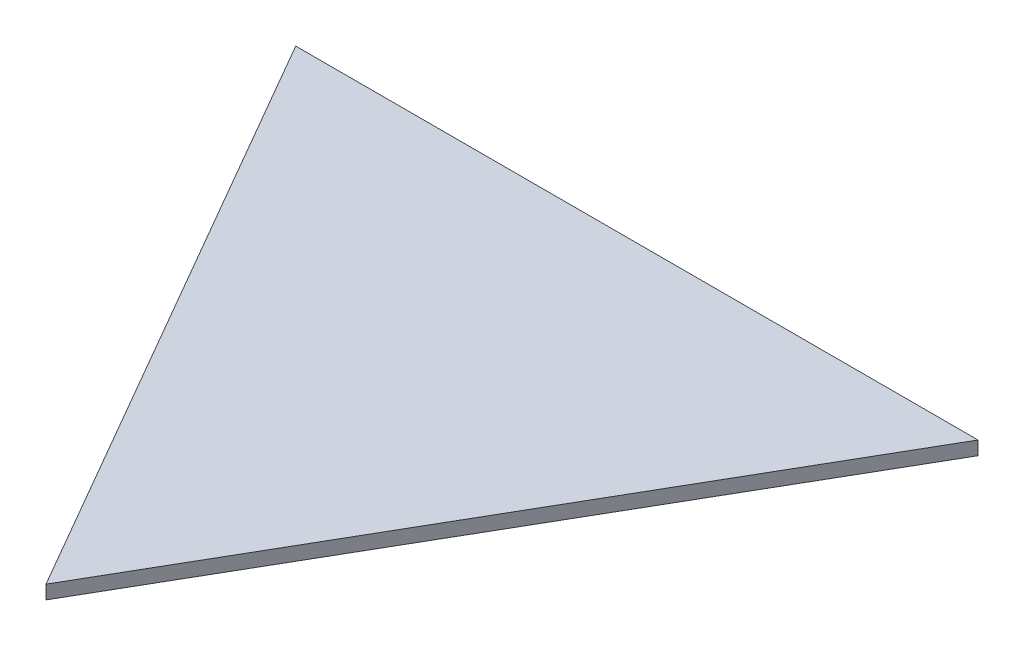
ISO-10303-21;
HEADER;
FILE_DESCRIPTION(('STEP AP214'),'2;1');
FILE_NAME('part.step','',(''),(''),'','','');
FILE_SCHEMA(('AUTOMOTIVE_DESIGN { 1 0 10303 214 1 1 1 1 }'));
ENDSEC;
DATA;
#1=APPLICATION_CONTEXT('core data for automotive mechanical design processes');
#2=APPLICATION_PROTOCOL_DEFINITION('international standard','automotive_design',2000,#1);
#3=PRODUCT_CONTEXT('',#1,'mechanical');
#4=PRODUCT('Part','Part','',(#3));
#5=PRODUCT_RELATED_PRODUCT_CATEGORY('part','',(#4));
#6=PRODUCT_DEFINITION_FORMATION('','',#4);
#7=PRODUCT_DEFINITION_CONTEXT('part definition',#1,'design');
#8=PRODUCT_DEFINITION('design','',#6,#7);
#9=PRODUCT_DEFINITION_SHAPE('','',#8);
#10=(LENGTH_UNIT() NAMED_UNIT(*) SI_UNIT(.MILLI.,.METRE.));
#11=(NAMED_UNIT(*) PLANE_ANGLE_UNIT() SI_UNIT($,.RADIAN.));
#12=(NAMED_UNIT(*) SI_UNIT($,.STERADIAN.) SOLID_ANGLE_UNIT());
#13=UNCERTAINTY_MEASURE_WITH_UNIT(LENGTH_MEASURE(1.E-05),#10,'distance_accuracy_value','');
#14=(GEOMETRIC_REPRESENTATION_CONTEXT(3) GLOBAL_UNCERTAINTY_ASSIGNED_CONTEXT((#13)) GLOBAL_UNIT_ASSIGNED_CONTEXT((#10,
#11,#12)) REPRESENTATION_CONTEXT('',''));
#15=CARTESIAN_POINT('',(0.,0.,0.));
#16=DIRECTION('',(0.,0.,1.));
#17=DIRECTION('',(1.,0.,0.));
#18=AXIS2_PLACEMENT_3D('',#15,#16,#17);
#19=CARTESIAN_POINT('',(250.,10.,-433.012701892219));
#20=DIRECTION('',(-0.866025403784439,0.,-0.5));
#21=DIRECTION('',(-0.5,0.,0.866025403784439));
#22=AXIS2_PLACEMENT_3D('',#19,#20,#21);
#23=PLANE('',#22);
#24=DIRECTION('',(0.5,0.,-0.866025403784439));
#25=VECTOR('',#24,1.);
#26=CARTESIAN_POINT('',(250.,0.,-433.012701892219));
#27=LINE('',#26,#25);
#28=CARTESIAN_POINT('',(0.,0.,0.));
#29=VERTEX_POINT('',#28);
#30=CARTESIAN_POINT('',(250.,0.,-433.012701892219));
#31=VERTEX_POINT('',#30);
#32=EDGE_CURVE('E80',#29,#31,#27,.T.);
#33=ORIENTED_EDGE('',*,*,#32,.T.);
#34=DIRECTION('',(0.,-1.,0.));
#35=VECTOR('',#34,1.);
#36=CARTESIAN_POINT('',(250.,10.,-433.012701892219));
#37=LINE('',#36,#35);
#38=CARTESIAN_POINT('',(250.,10.,-433.012701892219));
#39=VERTEX_POINT('',#38);
#40=EDGE_CURVE('E11',#39,#31,#37,.T.);
#41=ORIENTED_EDGE('',*,*,#40,.F.);
#42=DIRECTION('',(0.5,0.,-0.866025403784439));
#43=VECTOR('',#42,1.);
#44=CARTESIAN_POINT('',(250.,10.,-433.012701892219));
#45=LINE('',#44,#43);
#46=CARTESIAN_POINT('',(0.,10.,0.));
#47=VERTEX_POINT('',#46);
#48=EDGE_CURVE('E73',#47,#39,#45,.T.);
#49=ORIENTED_EDGE('',*,*,#48,.F.);
#50=DIRECTION('',(0.,-1.,0.));
#51=VECTOR('',#50,1.);
#52=CARTESIAN_POINT('',(0.,10.,0.));
#53=LINE('',#52,#51);
#54=EDGE_CURVE('E81',#47,#29,#53,.T.);
#55=ORIENTED_EDGE('',*,*,#54,.T.);
#56=EDGE_LOOP('',(#33,#41,#49,#55));
#57=FACE_BOUND('',#56,.T.);
#58=ADVANCED_FACE('F33',(#57),#23,.F.);
#59=CARTESIAN_POINT('',(-250.,10.,-433.012701892219));
#60=DIRECTION('',(0.,0.,1.));
#61=DIRECTION('',(1.,0.,0.));
#62=AXIS2_PLACEMENT_3D('',#59,#60,#61);
#63=PLANE('',#62);
#64=DIRECTION('',(-1.,0.,0.));
#65=VECTOR('',#64,1.);
#66=CARTESIAN_POINT('',(-250.,0.,-433.012701892219));
#67=LINE('',#66,#65);
#68=CARTESIAN_POINT('',(-250.,0.,-433.012701892219));
#69=VERTEX_POINT('',#68);
#70=EDGE_CURVE('E61',#31,#69,#67,.T.);
#71=ORIENTED_EDGE('',*,*,#70,.T.);
#72=DIRECTION('',(0.,-1.,0.));
#73=VECTOR('',#72,1.);
#74=CARTESIAN_POINT('',(-250.,10.,-433.012701892219));
#75=LINE('',#74,#73);
#76=CARTESIAN_POINT('',(-250.,10.,-433.012701892219));
#77=VERTEX_POINT('',#76);
#78=EDGE_CURVE('E41',#77,#69,#75,.T.);
#79=ORIENTED_EDGE('',*,*,#78,.F.);
#80=DIRECTION('',(-1.,0.,0.));
#81=VECTOR('',#80,1.);
#82=CARTESIAN_POINT('',(-250.,10.,-433.012701892219));
#83=LINE('',#82,#81);
#84=EDGE_CURVE('E69',#39,#77,#83,.T.);
#85=ORIENTED_EDGE('',*,*,#84,.F.);
#86=ORIENTED_EDGE('',*,*,#40,.T.);
#87=EDGE_LOOP('',(#71,#79,#85,#86));
#88=FACE_BOUND('',#87,.T.);
#89=ADVANCED_FACE('F70',(#88),#63,.F.);
#90=CARTESIAN_POINT('',(0.,10.,0.));
#91=DIRECTION('',(0.866025403784439,0.,-0.5));
#92=DIRECTION('',(-0.5,0.,-0.866025403784439));
#93=AXIS2_PLACEMENT_3D('',#90,#91,#92);
#94=PLANE('',#93);
#95=DIRECTION('',(0.5,0.,0.866025403784439));
#96=VECTOR('',#95,1.);
#97=CARTESIAN_POINT('',(0.,0.,0.));
#98=LINE('',#97,#96);
#99=EDGE_CURVE('E66',#69,#29,#98,.T.);
#100=ORIENTED_EDGE('',*,*,#99,.T.);
#101=ORIENTED_EDGE('',*,*,#54,.F.);
#102=DIRECTION('',(0.5,0.,0.866025403784439));
#103=VECTOR('',#102,1.);
#104=CARTESIAN_POINT('',(0.,10.,0.));
#105=LINE('',#104,#103);
#106=EDGE_CURVE('E49',#77,#47,#105,.T.);
#107=ORIENTED_EDGE('',*,*,#106,.F.);
#108=ORIENTED_EDGE('',*,*,#78,.T.);
#109=EDGE_LOOP('',(#100,#101,#107,#108));
#110=FACE_BOUND('',#109,.T.);
#111=ADVANCED_FACE('F88',(#110),#94,.F.);
#112=CARTESIAN_POINT('',(0.,10.,0.));
#113=DIRECTION('',(0.,-1.,0.));
#114=DIRECTION('',(0.,0.,-1.));
#115=AXIS2_PLACEMENT_3D('',#112,#113,#114);
#116=PLANE('',#115);
#117=ORIENTED_EDGE('',*,*,#48,.T.);
#118=ORIENTED_EDGE('',*,*,#84,.T.);
#119=ORIENTED_EDGE('',*,*,#106,.T.);
#120=EDGE_LOOP('',(#117,#118,#119));
#121=FACE_BOUND('',#120,.T.);
#122=ADVANCED_FACE('F76',(#121),#116,.F.);
#123=CARTESIAN_POINT('',(0.,0.,0.));
#124=DIRECTION('',(0.,-1.,0.));
#125=DIRECTION('',(0.,0.,-1.));
#126=AXIS2_PLACEMENT_3D('',#123,#124,#125);
#127=PLANE('',#126);
#128=ORIENTED_EDGE('',*,*,#32,.F.);
#129=ORIENTED_EDGE('',*,*,#99,.F.);
#130=ORIENTED_EDGE('',*,*,#70,.F.);
#131=EDGE_LOOP('',(#128,#129,#130));
#132=FACE_BOUND('',#131,.T.);
#133=ADVANCED_FACE('F89',(#132),#127,.T.);
#134=CLOSED_SHELL('',(#58,#89,#111,#122,#133));
#135=MANIFOLD_SOLID_BREP('B2',#134);
#136=ADVANCED_BREP_SHAPE_REPRESENTATION('',(#18,#135),#14);
#137=SHAPE_DEFINITION_REPRESENTATION(#9,#136);
ENDSEC;
END-ISO-10303-21;
